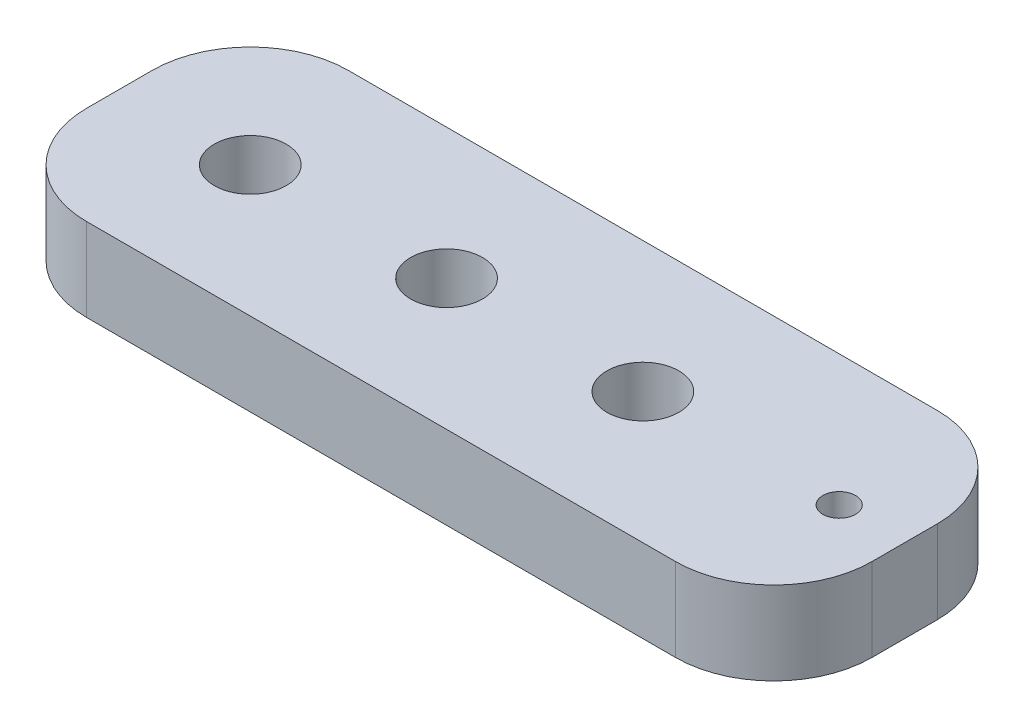
ISO-10303-21;
HEADER;
FILE_DESCRIPTION(('STEP AP214'),'2;1');
FILE_NAME('part.step','',(''),(''),'','','');
FILE_SCHEMA(('AUTOMOTIVE_DESIGN { 1 0 10303 214 1 1 1 1 }'));
ENDSEC;
DATA;
#1=APPLICATION_CONTEXT('core data for automotive mechanical design processes');
#2=APPLICATION_PROTOCOL_DEFINITION('international standard','automotive_design',2000,#1);
#3=PRODUCT_CONTEXT('',#1,'mechanical');
#4=PRODUCT('Part','Part','',(#3));
#5=PRODUCT_RELATED_PRODUCT_CATEGORY('part','',(#4));
#6=PRODUCT_DEFINITION_FORMATION('','',#4);
#7=PRODUCT_DEFINITION_CONTEXT('part definition',#1,'design');
#8=PRODUCT_DEFINITION('design','',#6,#7);
#9=PRODUCT_DEFINITION_SHAPE('','',#8);
#10=(LENGTH_UNIT() NAMED_UNIT(*) SI_UNIT(.MILLI.,.METRE.));
#11=(NAMED_UNIT(*) PLANE_ANGLE_UNIT() SI_UNIT($,.RADIAN.));
#12=(NAMED_UNIT(*) SI_UNIT($,.STERADIAN.) SOLID_ANGLE_UNIT());
#13=UNCERTAINTY_MEASURE_WITH_UNIT(LENGTH_MEASURE(1.E-05),#10,'distance_accuracy_value','');
#14=(GEOMETRIC_REPRESENTATION_CONTEXT(3) GLOBAL_UNCERTAINTY_ASSIGNED_CONTEXT((#13)) GLOBAL_UNIT_ASSIGNED_CONTEXT((#10,
#11,#12)) REPRESENTATION_CONTEXT('',''));
#15=CARTESIAN_POINT('',(0.,0.,0.));
#16=DIRECTION('',(0.,0.,1.));
#17=DIRECTION('',(1.,0.,0.));
#18=AXIS2_PLACEMENT_3D('',#15,#16,#17);
#19=CARTESIAN_POINT('',(0.,6.35,0.));
#20=DIRECTION('',(1.,0.,0.));
#21=DIRECTION('',(0.,0.,-1.));
#22=AXIS2_PLACEMENT_3D('',#19,#20,#21);
#23=PLANE('',#22);
#24=DIRECTION('',(0.,0.,1.));
#25=VECTOR('',#24,1.);
#26=CARTESIAN_POINT('',(0.,6.35,0.));
#27=LINE('',#26,#25);
#28=CARTESIAN_POINT('',(0.,6.35,-12.5));
#29=VERTEX_POINT('',#28);
#30=CARTESIAN_POINT('',(0.,6.35,-7.5));
#31=VERTEX_POINT('',#30);
#32=EDGE_CURVE('E128',#29,#31,#27,.T.);
#33=ORIENTED_EDGE('',*,*,#32,.F.);
#34=DIRECTION('',(0.,-1.,0.));
#35=VECTOR('',#34,1.);
#36=CARTESIAN_POINT('',(0.,6.35,-12.5));
#37=LINE('',#36,#35);
#38=CARTESIAN_POINT('',(0.,0.,-12.5));
#39=VERTEX_POINT('',#38);
#40=EDGE_CURVE('E11',#29,#39,#37,.T.);
#41=ORIENTED_EDGE('',*,*,#40,.T.);
#42=DIRECTION('',(0.,0.,1.));
#43=VECTOR('',#42,1.);
#44=CARTESIAN_POINT('',(0.,0.,0.));
#45=LINE('',#44,#43);
#46=CARTESIAN_POINT('',(0.,0.,-7.5));
#47=VERTEX_POINT('',#46);
#48=EDGE_CURVE('E130',#39,#47,#45,.T.);
#49=ORIENTED_EDGE('',*,*,#48,.T.);
#50=DIRECTION('',(0.,-1.,0.));
#51=VECTOR('',#50,1.);
#52=CARTESIAN_POINT('',(0.,6.35,-7.5));
#53=LINE('',#52,#51);
#54=EDGE_CURVE('E41',#47,#31,#53,.F.);
#55=ORIENTED_EDGE('',*,*,#54,.T.);
#56=EDGE_LOOP('',(#33,#41,#49,#55));
#57=FACE_BOUND('',#56,.T.);
#58=ADVANCED_FACE('F33',(#57),#23,.F.);
#59=CARTESIAN_POINT('',(0.,6.35,0.));
#60=DIRECTION('',(0.,0.,-1.));
#61=DIRECTION('',(-1.,0.,0.));
#62=AXIS2_PLACEMENT_3D('',#59,#60,#61);
#63=PLANE('',#62);
#64=DIRECTION('',(1.,0.,0.));
#65=VECTOR('',#64,1.);
#66=CARTESIAN_POINT('',(0.,0.,0.));
#67=LINE('',#66,#65);
#68=CARTESIAN_POINT('',(7.5,0.,0.));
#69=VERTEX_POINT('',#68);
#70=CARTESIAN_POINT('',(52.5,0.,0.));
#71=VERTEX_POINT('',#70);
#72=EDGE_CURVE('E126',#69,#71,#67,.T.);
#73=ORIENTED_EDGE('',*,*,#72,.T.);
#74=DIRECTION('',(0.,-1.,0.));
#75=VECTOR('',#74,1.);
#76=CARTESIAN_POINT('',(52.5,6.35,0.));
#77=LINE('',#76,#75);
#78=CARTESIAN_POINT('',(52.5,6.35,0.));
#79=VERTEX_POINT('',#78);
#80=EDGE_CURVE('E105',#71,#79,#77,.F.);
#81=ORIENTED_EDGE('',*,*,#80,.T.);
#82=DIRECTION('',(1.,0.,0.));
#83=VECTOR('',#82,1.);
#84=CARTESIAN_POINT('',(0.,6.35,0.));
#85=LINE('',#84,#83);
#86=CARTESIAN_POINT('',(7.5,6.35,0.));
#87=VERTEX_POINT('',#86);
#88=EDGE_CURVE('E166',#87,#79,#85,.T.);
#89=ORIENTED_EDGE('',*,*,#88,.F.);
#90=DIRECTION('',(0.,-1.,0.));
#91=VECTOR('',#90,1.);
#92=CARTESIAN_POINT('',(7.5,6.35,0.));
#93=LINE('',#92,#91);
#94=EDGE_CURVE('E110',#87,#69,#93,.T.);
#95=ORIENTED_EDGE('',*,*,#94,.T.);
#96=EDGE_LOOP('',(#73,#81,#89,#95));
#97=FACE_BOUND('',#96,.T.);
#98=ADVANCED_FACE('F170',(#97),#63,.F.);
#99=CARTESIAN_POINT('',(60.,6.35,0.));
#100=DIRECTION('',(-1.,0.,0.));
#101=DIRECTION('',(0.,0.,1.));
#102=AXIS2_PLACEMENT_3D('',#99,#100,#101);
#103=PLANE('',#102);
#104=DIRECTION('',(0.,0.,-1.));
#105=VECTOR('',#104,1.);
#106=CARTESIAN_POINT('',(60.,6.35,0.));
#107=LINE('',#106,#105);
#108=CARTESIAN_POINT('',(60.,6.35,-7.5));
#109=VERTEX_POINT('',#108);
#110=CARTESIAN_POINT('',(60.,6.35,-12.5));
#111=VERTEX_POINT('',#110);
#112=EDGE_CURVE('E119',#109,#111,#107,.T.);
#113=ORIENTED_EDGE('',*,*,#112,.F.);
#114=DIRECTION('',(0.,-1.,0.));
#115=VECTOR('',#114,1.);
#116=CARTESIAN_POINT('',(60.,6.35,-7.5));
#117=LINE('',#116,#115);
#118=CARTESIAN_POINT('',(60.,0.,-7.5));
#119=VERTEX_POINT('',#118);
#120=EDGE_CURVE('E104',#109,#119,#117,.T.);
#121=ORIENTED_EDGE('',*,*,#120,.T.);
#122=DIRECTION('',(0.,0.,-1.));
#123=VECTOR('',#122,1.);
#124=CARTESIAN_POINT('',(60.,0.,0.));
#125=LINE('',#124,#123);
#126=CARTESIAN_POINT('',(60.,0.,-12.5));
#127=VERTEX_POINT('',#126);
#128=EDGE_CURVE('E117',#119,#127,#125,.T.);
#129=ORIENTED_EDGE('',*,*,#128,.T.);
#130=DIRECTION('',(0.,-1.,0.));
#131=VECTOR('',#130,1.);
#132=CARTESIAN_POINT('',(60.,6.35,-12.5));
#133=LINE('',#132,#131);
#134=EDGE_CURVE('E121',#127,#111,#133,.F.);
#135=ORIENTED_EDGE('',*,*,#134,.T.);
#136=EDGE_LOOP('',(#113,#121,#129,#135));
#137=FACE_BOUND('',#136,.T.);
#138=ADVANCED_FACE('F116',(#137),#103,.F.);
#139=CARTESIAN_POINT('',(0.,6.35,-20.));
#140=DIRECTION('',(0.,0.,1.));
#141=DIRECTION('',(1.,0.,0.));
#142=AXIS2_PLACEMENT_3D('',#139,#140,#141);
#143=PLANE('',#142);
#144=DIRECTION('',(-1.,0.,0.));
#145=VECTOR('',#144,1.);
#146=CARTESIAN_POINT('',(0.,6.35,-20.));
#147=LINE('',#146,#145);
#148=CARTESIAN_POINT('',(52.5,6.35,-20.));
#149=VERTEX_POINT('',#148);
#150=CARTESIAN_POINT('',(7.5,6.35,-20.));
#151=VERTEX_POINT('',#150);
#152=EDGE_CURVE('E134',#149,#151,#147,.T.);
#153=ORIENTED_EDGE('',*,*,#152,.F.);
#154=DIRECTION('',(0.,-1.,0.));
#155=VECTOR('',#154,1.);
#156=CARTESIAN_POINT('',(52.5,6.35,-20.));
#157=LINE('',#156,#155);
#158=CARTESIAN_POINT('',(52.5,0.,-20.));
#159=VERTEX_POINT('',#158);
#160=EDGE_CURVE('E151',#149,#159,#157,.T.);
#161=ORIENTED_EDGE('',*,*,#160,.T.);
#162=DIRECTION('',(-1.,0.,0.));
#163=VECTOR('',#162,1.);
#164=CARTESIAN_POINT('',(0.,0.,-20.));
#165=LINE('',#164,#163);
#166=CARTESIAN_POINT('',(7.5,0.,-20.));
#167=VERTEX_POINT('',#166);
#168=EDGE_CURVE('E125',#159,#167,#165,.T.);
#169=ORIENTED_EDGE('',*,*,#168,.T.);
#170=DIRECTION('',(0.,-1.,0.));
#171=VECTOR('',#170,1.);
#172=CARTESIAN_POINT('',(7.5,6.35,-20.));
#173=LINE('',#172,#171);
#174=EDGE_CURVE('E48',#167,#151,#173,.F.);
#175=ORIENTED_EDGE('',*,*,#174,.T.);
#176=EDGE_LOOP('',(#153,#161,#169,#175));
#177=FACE_BOUND('',#176,.T.);
#178=ADVANCED_FACE('F204',(#177),#143,.F.);
#179=CARTESIAN_POINT('',(0.,6.35,0.));
#180=DIRECTION('',(0.,-1.,0.));
#181=DIRECTION('',(0.,0.,-1.));
#182=AXIS2_PLACEMENT_3D('',#179,#180,#181);
#183=PLANE('',#182);
#184=CARTESIAN_POINT('',(55.,6.35,-10.));
#185=DIRECTION('',(0.,1.,0.));
#186=DIRECTION('',(0.,0.,1.));
#187=AXIS2_PLACEMENT_3D('',#184,#185,#186);
#188=CIRCLE('',#187,1.24999999999999);
#189=CARTESIAN_POINT('',(55.,6.35,-8.75000000000001));
#190=VERTEX_POINT('',#189);
#191=EDGE_CURVE('E196',#190,#190,#188,.T.);
#192=ORIENTED_EDGE('',*,*,#191,.F.);
#193=EDGE_LOOP('',(#192));
#194=FACE_BOUND('',#193,.T.);
#195=CARTESIAN_POINT('',(10.,6.35,-10.));
#196=DIRECTION('',(0.,1.,0.));
#197=DIRECTION('',(0.,0.,1.));
#198=AXIS2_PLACEMENT_3D('',#195,#196,#197);
#199=CIRCLE('',#198,2.75);
#200=CARTESIAN_POINT('',(10.,6.35,-7.25));
#201=VERTEX_POINT('',#200);
#202=EDGE_CURVE('E190',#201,#201,#199,.T.);
#203=ORIENTED_EDGE('',*,*,#202,.F.);
#204=EDGE_LOOP('',(#203));
#205=FACE_BOUND('',#204,.T.);
#206=CARTESIAN_POINT('',(25.,6.35,-10.));
#207=DIRECTION('',(0.,1.,0.));
#208=DIRECTION('',(0.,0.,1.));
#209=AXIS2_PLACEMENT_3D('',#206,#207,#208);
#210=CIRCLE('',#209,2.75);
#211=CARTESIAN_POINT('',(25.,6.35,-7.25));
#212=VERTEX_POINT('',#211);
#213=EDGE_CURVE('E184',#212,#212,#210,.T.);
#214=ORIENTED_EDGE('',*,*,#213,.F.);
#215=EDGE_LOOP('',(#214));
#216=FACE_BOUND('',#215,.T.);
#217=CARTESIAN_POINT('',(40.,6.35,-10.));
#218=DIRECTION('',(0.,1.,0.));
#219=DIRECTION('',(0.,0.,1.));
#220=AXIS2_PLACEMENT_3D('',#217,#218,#219);
#221=CIRCLE('',#220,2.75);
#222=CARTESIAN_POINT('',(40.,6.35,-7.25));
#223=VERTEX_POINT('',#222);
#224=EDGE_CURVE('E173',#223,#223,#221,.T.);
#225=ORIENTED_EDGE('',*,*,#224,.F.);
#226=EDGE_LOOP('',(#225));
#227=FACE_BOUND('',#226,.T.);
#228=ORIENTED_EDGE('',*,*,#88,.T.);
#229=CARTESIAN_POINT('',(52.5,6.35,-7.5));
#230=DIRECTION('',(0.,-1.,0.));
#231=DIRECTION('',(0.,0.,-1.));
#232=AXIS2_PLACEMENT_3D('',#229,#230,#231);
#233=CIRCLE('',#232,7.5);
#234=EDGE_CURVE('E148',#79,#109,#233,.F.);
#235=ORIENTED_EDGE('',*,*,#234,.T.);
#236=ORIENTED_EDGE('',*,*,#112,.T.);
#237=CARTESIAN_POINT('',(52.5,6.35,-12.5));
#238=DIRECTION('',(0.,-1.,0.));
#239=DIRECTION('',(0.,0.,-1.));
#240=AXIS2_PLACEMENT_3D('',#237,#238,#239);
#241=CIRCLE('',#240,7.5);
#242=EDGE_CURVE('E55',#111,#149,#241,.F.);
#243=ORIENTED_EDGE('',*,*,#242,.T.);
#244=ORIENTED_EDGE('',*,*,#152,.T.);
#245=CARTESIAN_POINT('',(7.5,6.35,-12.5));
#246=DIRECTION('',(0.,-1.,0.));
#247=DIRECTION('',(0.,0.,-1.));
#248=AXIS2_PLACEMENT_3D('',#245,#246,#247);
#249=CIRCLE('',#248,7.5);
#250=EDGE_CURVE('E145',#151,#29,#249,.F.);
#251=ORIENTED_EDGE('',*,*,#250,.T.);
#252=ORIENTED_EDGE('',*,*,#32,.T.);
#253=CARTESIAN_POINT('',(7.5,6.35,-7.5));
#254=DIRECTION('',(0.,-1.,0.));
#255=DIRECTION('',(0.,0.,-1.));
#256=AXIS2_PLACEMENT_3D('',#253,#254,#255);
#257=CIRCLE('',#256,7.5);
#258=EDGE_CURVE('E143',#31,#87,#257,.F.);
#259=ORIENTED_EDGE('',*,*,#258,.T.);
#260=EDGE_LOOP('',(#228,#235,#236,#243,#244,#251,#252,#259));
#261=FACE_BOUND('',#260,.T.);
#262=ADVANCED_FACE('F163',(#194,#205,#216,#227,#261),#183,.F.);
#263=CARTESIAN_POINT('',(0.,0.,0.));
#264=DIRECTION('',(0.,-1.,0.));
#265=DIRECTION('',(0.,0.,-1.));
#266=AXIS2_PLACEMENT_3D('',#263,#264,#265);
#267=PLANE('',#266);
#268=CARTESIAN_POINT('',(55.,0.,-10.));
#269=DIRECTION('',(0.,1.,0.));
#270=DIRECTION('',(0.,0.,1.));
#271=AXIS2_PLACEMENT_3D('',#268,#269,#270);
#272=CIRCLE('',#271,1.24999999999999);
#273=CARTESIAN_POINT('',(55.,0.,-8.75000000000001));
#274=VERTEX_POINT('',#273);
#275=EDGE_CURVE('E193',#274,#274,#272,.T.);
#276=ORIENTED_EDGE('',*,*,#275,.T.);
#277=EDGE_LOOP('',(#276));
#278=FACE_BOUND('',#277,.T.);
#279=CARTESIAN_POINT('',(10.,0.,-10.));
#280=DIRECTION('',(0.,1.,0.));
#281=DIRECTION('',(0.,0.,1.));
#282=AXIS2_PLACEMENT_3D('',#279,#280,#281);
#283=CIRCLE('',#282,2.75);
#284=CARTESIAN_POINT('',(10.,0.,-7.25));
#285=VERTEX_POINT('',#284);
#286=EDGE_CURVE('E187',#285,#285,#283,.T.);
#287=ORIENTED_EDGE('',*,*,#286,.T.);
#288=EDGE_LOOP('',(#287));
#289=FACE_BOUND('',#288,.T.);
#290=CARTESIAN_POINT('',(25.,0.,-10.));
#291=DIRECTION('',(0.,1.,0.));
#292=DIRECTION('',(0.,0.,1.));
#293=AXIS2_PLACEMENT_3D('',#290,#291,#292);
#294=CIRCLE('',#293,2.75);
#295=CARTESIAN_POINT('',(25.,0.,-7.25));
#296=VERTEX_POINT('',#295);
#297=EDGE_CURVE('E181',#296,#296,#294,.T.);
#298=ORIENTED_EDGE('',*,*,#297,.T.);
#299=EDGE_LOOP('',(#298));
#300=FACE_BOUND('',#299,.T.);
#301=CARTESIAN_POINT('',(40.,0.,-10.));
#302=DIRECTION('',(0.,1.,0.));
#303=DIRECTION('',(0.,0.,1.));
#304=AXIS2_PLACEMENT_3D('',#301,#302,#303);
#305=CIRCLE('',#304,2.75);
#306=CARTESIAN_POINT('',(40.,0.,-7.25));
#307=VERTEX_POINT('',#306);
#308=EDGE_CURVE('E171',#307,#307,#305,.T.);
#309=ORIENTED_EDGE('',*,*,#308,.T.);
#310=EDGE_LOOP('',(#309));
#311=FACE_BOUND('',#310,.T.);
#312=ORIENTED_EDGE('',*,*,#128,.F.);
#313=CARTESIAN_POINT('',(52.5,0.,-7.5));
#314=DIRECTION('',(0.,-1.,0.));
#315=DIRECTION('',(0.,0.,-1.));
#316=AXIS2_PLACEMENT_3D('',#313,#314,#315);
#317=CIRCLE('',#316,7.5);
#318=EDGE_CURVE('E100',#119,#71,#317,.T.);
#319=ORIENTED_EDGE('',*,*,#318,.T.);
#320=ORIENTED_EDGE('',*,*,#72,.F.);
#321=CARTESIAN_POINT('',(7.5,0.,-7.5));
#322=DIRECTION('',(0.,-1.,0.));
#323=DIRECTION('',(0.,0.,-1.));
#324=AXIS2_PLACEMENT_3D('',#321,#322,#323);
#325=CIRCLE('',#324,7.5);
#326=EDGE_CURVE('E120',#69,#47,#325,.T.);
#327=ORIENTED_EDGE('',*,*,#326,.T.);
#328=ORIENTED_EDGE('',*,*,#48,.F.);
#329=CARTESIAN_POINT('',(7.5,0.,-12.5));
#330=DIRECTION('',(0.,-1.,0.));
#331=DIRECTION('',(0.,0.,-1.));
#332=AXIS2_PLACEMENT_3D('',#329,#330,#331);
#333=CIRCLE('',#332,7.5);
#334=EDGE_CURVE('E137',#39,#167,#333,.T.);
#335=ORIENTED_EDGE('',*,*,#334,.T.);
#336=ORIENTED_EDGE('',*,*,#168,.F.);
#337=CARTESIAN_POINT('',(52.5,0.,-12.5));
#338=DIRECTION('',(0.,-1.,0.));
#339=DIRECTION('',(0.,0.,-1.));
#340=AXIS2_PLACEMENT_3D('',#337,#338,#339);
#341=CIRCLE('',#340,7.5);
#342=EDGE_CURVE('E111',#159,#127,#341,.T.);
#343=ORIENTED_EDGE('',*,*,#342,.T.);
#344=EDGE_LOOP('',(#312,#319,#320,#327,#328,#335,#336,#343));
#345=FACE_BOUND('',#344,.T.);
#346=ADVANCED_FACE('F123',(#278,#289,#300,#311,#345),#267,.T.);
#347=CARTESIAN_POINT('',(40.,6.35,-10.));
#348=DIRECTION('',(0.,1.,0.));
#349=DIRECTION('',(0.,0.,1.));
#350=AXIS2_PLACEMENT_3D('',#347,#348,#349);
#351=CYLINDRICAL_SURFACE('',#350,2.75);
#352=ORIENTED_EDGE('',*,*,#308,.F.);
#353=EDGE_LOOP('',(#352));
#354=FACE_BOUND('',#353,.T.);
#355=ORIENTED_EDGE('',*,*,#224,.T.);
#356=EDGE_LOOP('',(#355));
#357=FACE_BOUND('',#356,.T.);
#358=ADVANCED_FACE('F212',(#354,#357),#351,.F.);
#359=CARTESIAN_POINT('',(25.,6.35,-10.));
#360=DIRECTION('',(0.,1.,0.));
#361=DIRECTION('',(0.,0.,1.));
#362=AXIS2_PLACEMENT_3D('',#359,#360,#361);
#363=CYLINDRICAL_SURFACE('',#362,2.75);
#364=ORIENTED_EDGE('',*,*,#297,.F.);
#365=EDGE_LOOP('',(#364));
#366=FACE_BOUND('',#365,.T.);
#367=ORIENTED_EDGE('',*,*,#213,.T.);
#368=EDGE_LOOP('',(#367));
#369=FACE_BOUND('',#368,.T.);
#370=ADVANCED_FACE('F214',(#366,#369),#363,.F.);
#371=CARTESIAN_POINT('',(10.,6.35,-10.));
#372=DIRECTION('',(0.,1.,0.));
#373=DIRECTION('',(0.,0.,1.));
#374=AXIS2_PLACEMENT_3D('',#371,#372,#373);
#375=CYLINDRICAL_SURFACE('',#374,2.75);
#376=ORIENTED_EDGE('',*,*,#286,.F.);
#377=EDGE_LOOP('',(#376));
#378=FACE_BOUND('',#377,.T.);
#379=ORIENTED_EDGE('',*,*,#202,.T.);
#380=EDGE_LOOP('',(#379));
#381=FACE_BOUND('',#380,.T.);
#382=ADVANCED_FACE('F221',(#378,#381),#375,.F.);
#383=CARTESIAN_POINT('',(55.,6.35,-10.));
#384=DIRECTION('',(0.,1.,0.));
#385=DIRECTION('',(0.,0.,1.));
#386=AXIS2_PLACEMENT_3D('',#383,#384,#385);
#387=CYLINDRICAL_SURFACE('',#386,1.24999999999999);
#388=ORIENTED_EDGE('',*,*,#275,.F.);
#389=EDGE_LOOP('',(#388));
#390=FACE_BOUND('',#389,.T.);
#391=ORIENTED_EDGE('',*,*,#191,.T.);
#392=EDGE_LOOP('',(#391));
#393=FACE_BOUND('',#392,.T.);
#394=ADVANCED_FACE('F200',(#390,#393),#387,.F.);
#395=CARTESIAN_POINT('',(52.5,6.35,-7.5));
#396=DIRECTION('',(0.,-1.,0.));
#397=DIRECTION('',(0.,0.,-1.));
#398=AXIS2_PLACEMENT_3D('',#395,#396,#397);
#399=CYLINDRICAL_SURFACE('',#398,7.5);
#400=ORIENTED_EDGE('',*,*,#234,.F.);
#401=ORIENTED_EDGE('',*,*,#80,.F.);
#402=ORIENTED_EDGE('',*,*,#318,.F.);
#403=ORIENTED_EDGE('',*,*,#120,.F.);
#404=EDGE_LOOP('',(#400,#401,#402,#403));
#405=FACE_BOUND('',#404,.T.);
#406=ADVANCED_FACE('F103',(#405),#399,.T.);
#407=CARTESIAN_POINT('',(52.5,6.35,-12.5));
#408=DIRECTION('',(0.,-1.,0.));
#409=DIRECTION('',(0.,0.,-1.));
#410=AXIS2_PLACEMENT_3D('',#407,#408,#409);
#411=CYLINDRICAL_SURFACE('',#410,7.5);
#412=ORIENTED_EDGE('',*,*,#242,.F.);
#413=ORIENTED_EDGE('',*,*,#134,.F.);
#414=ORIENTED_EDGE('',*,*,#342,.F.);
#415=ORIENTED_EDGE('',*,*,#160,.F.);
#416=EDGE_LOOP('',(#412,#413,#414,#415));
#417=FACE_BOUND('',#416,.T.);
#418=ADVANCED_FACE('F237',(#417),#411,.T.);
#419=CARTESIAN_POINT('',(7.5,6.35,-12.5));
#420=DIRECTION('',(0.,-1.,0.));
#421=DIRECTION('',(0.,0.,-1.));
#422=AXIS2_PLACEMENT_3D('',#419,#420,#421);
#423=CYLINDRICAL_SURFACE('',#422,7.5);
#424=ORIENTED_EDGE('',*,*,#250,.F.);
#425=ORIENTED_EDGE('',*,*,#174,.F.);
#426=ORIENTED_EDGE('',*,*,#334,.F.);
#427=ORIENTED_EDGE('',*,*,#40,.F.);
#428=EDGE_LOOP('',(#424,#425,#426,#427));
#429=FACE_BOUND('',#428,.T.);
#430=ADVANCED_FACE('F239',(#429),#423,.T.);
#431=CARTESIAN_POINT('',(7.5,6.35,-7.5));
#432=DIRECTION('',(0.,-1.,0.));
#433=DIRECTION('',(0.,0.,-1.));
#434=AXIS2_PLACEMENT_3D('',#431,#432,#433);
#435=CYLINDRICAL_SURFACE('',#434,7.5);
#436=ORIENTED_EDGE('',*,*,#258,.F.);
#437=ORIENTED_EDGE('',*,*,#54,.F.);
#438=ORIENTED_EDGE('',*,*,#326,.F.);
#439=ORIENTED_EDGE('',*,*,#94,.F.);
#440=EDGE_LOOP('',(#436,#437,#438,#439));
#441=FACE_BOUND('',#440,.T.);
#442=ADVANCED_FACE('F35',(#441),#435,.T.);
#443=CLOSED_SHELL('',(#58,#98,#138,#178,#262,#346,#358,#370,#382,#394,#406,#418,#430,#442));
#444=MANIFOLD_SOLID_BREP('B2',#443);
#445=ADVANCED_BREP_SHAPE_REPRESENTATION('',(#18,#444),#14);
#446=SHAPE_DEFINITION_REPRESENTATION(#9,#445);
ENDSEC;
END-ISO-10303-21;
